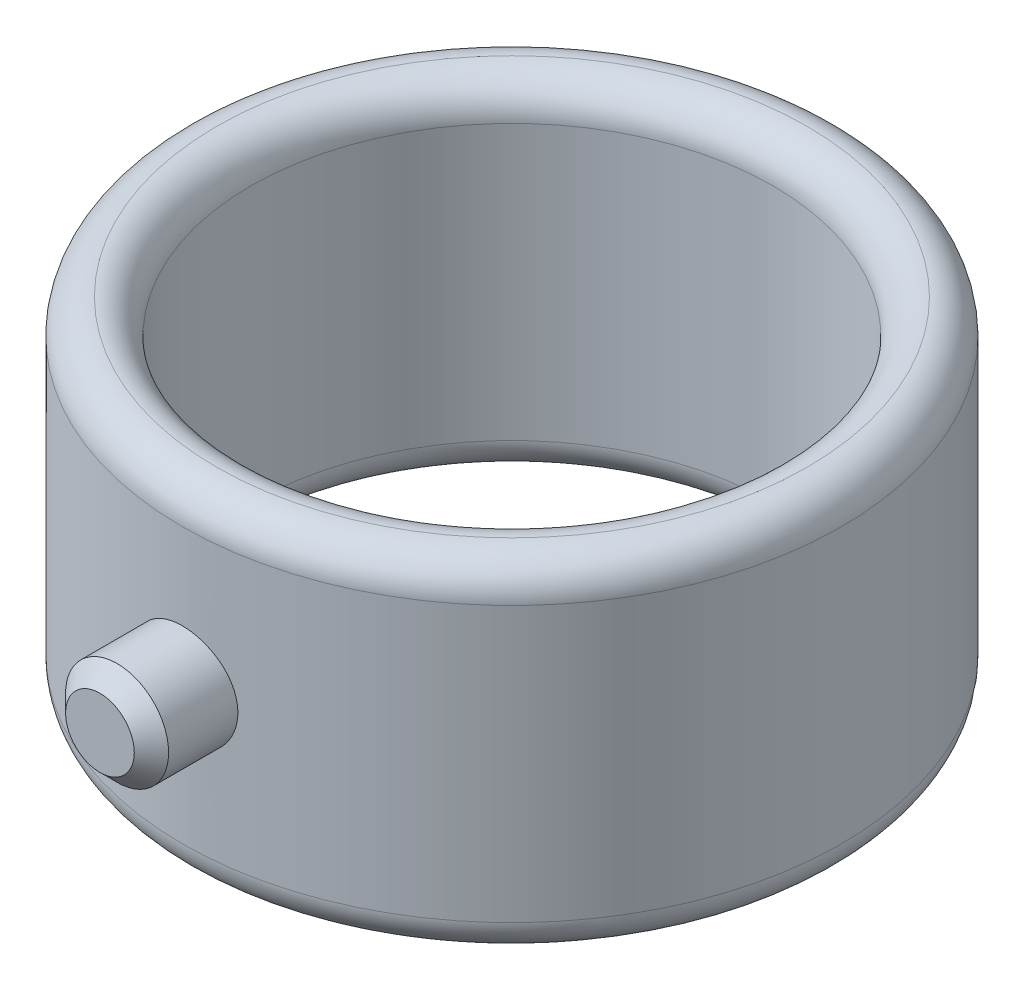
ISO-10303-21;
HEADER;
FILE_DESCRIPTION(('STEP AP214'),'2;1');
FILE_NAME('part.step','',(''),(''),'','','');
FILE_SCHEMA(('AUTOMOTIVE_DESIGN { 1 0 10303 214 1 1 1 1 }'));
ENDSEC;
DATA;
#1=APPLICATION_CONTEXT('core data for automotive mechanical design processes');
#2=APPLICATION_PROTOCOL_DEFINITION('international standard','automotive_design',2000,#1);
#3=PRODUCT_CONTEXT('',#1,'mechanical');
#4=PRODUCT('Part','Part','',(#3));
#5=PRODUCT_RELATED_PRODUCT_CATEGORY('part','',(#4));
#6=PRODUCT_DEFINITION_FORMATION('','',#4);
#7=PRODUCT_DEFINITION_CONTEXT('part definition',#1,'design');
#8=PRODUCT_DEFINITION('design','',#6,#7);
#9=PRODUCT_DEFINITION_SHAPE('','',#8);
#10=(LENGTH_UNIT() NAMED_UNIT(*) SI_UNIT(.MILLI.,.METRE.));
#11=(NAMED_UNIT(*) PLANE_ANGLE_UNIT() SI_UNIT($,.RADIAN.));
#12=(NAMED_UNIT(*) SI_UNIT($,.STERADIAN.) SOLID_ANGLE_UNIT());
#13=UNCERTAINTY_MEASURE_WITH_UNIT(LENGTH_MEASURE(1.E-05),#10,'distance_accuracy_value','');
#14=(GEOMETRIC_REPRESENTATION_CONTEXT(3) GLOBAL_UNCERTAINTY_ASSIGNED_CONTEXT((#13)) GLOBAL_UNIT_ASSIGNED_CONTEXT((#10,
#11,#12)) REPRESENTATION_CONTEXT('',''));
#15=CARTESIAN_POINT('',(0.,0.,0.));
#16=DIRECTION('',(0.,0.,1.));
#17=DIRECTION('',(1.,0.,0.));
#18=AXIS2_PLACEMENT_3D('',#15,#16,#17);
#19=CARTESIAN_POINT('',(0.,10.,0.));
#20=DIRECTION('',(0.,-1.,0.));
#21=DIRECTION('',(0.,0.,-1.));
#22=AXIS2_PLACEMENT_3D('',#19,#20,#21);
#23=CYLINDRICAL_SURFACE('',#22,9.6);
#24=CARTESIAN_POINT('',(0.,0.999999999999999,0.));
#25=DIRECTION('',(0.,1.,0.));
#26=DIRECTION('',(0.,0.,1.));
#27=AXIS2_PLACEMENT_3D('',#24,#25,#26);
#28=CIRCLE('',#27,9.6);
#29=CARTESIAN_POINT('',(0.,0.999999999999999,9.6));
#30=VERTEX_POINT('',#29);
#31=EDGE_CURVE('E61',#30,#30,#28,.T.);
#32=ORIENTED_EDGE('',*,*,#31,.T.);
#33=EDGE_LOOP('',(#32));
#34=FACE_BOUND('',#33,.T.);
#35=CARTESIAN_POINT('',(0.,9.,0.));
#36=DIRECTION('',(0.,1.,0.));
#37=DIRECTION('',(0.,0.,1.));
#38=AXIS2_PLACEMENT_3D('',#35,#36,#37);
#39=CIRCLE('',#38,9.6);
#40=CARTESIAN_POINT('',(0.,9.,9.6));
#41=VERTEX_POINT('',#40);
#42=EDGE_CURVE('E74',#41,#41,#39,.F.);
#43=ORIENTED_EDGE('',*,*,#42,.T.);
#44=EDGE_LOOP('',(#43));
#45=FACE_BOUND('',#44,.T.);
#46=CARTESIAN_POINT('',(0.,6.5,-9.6));
#47=CARTESIAN_POINT('',(-0.0837090583626197,6.49999658103709,-9.5999986211669));
#48=CARTESIAN_POINT('',(-0.167465642919422,6.49296913173587,-9.59889367491444));
#49=CARTESIAN_POINT('',(-0.332634788986861,6.46505378523395,-9.59459218858556));
#50=CARTESIAN_POINT('',(-0.41404503679399,6.44415266449789,-9.59139365306834));
#51=CARTESIAN_POINT('',(-0.572107522828442,6.38913220231603,-9.58326418299466));
#52=CARTESIAN_POINT('',(-0.648763411373941,6.35502315118304,-9.57833459737903));
#53=CARTESIAN_POINT('',(-0.795252750626759,6.27458087291503,-9.56728676422893));
#54=CARTESIAN_POINT('',(-0.865087086220985,6.22824923417843,-9.56116867117532));
#55=CARTESIAN_POINT('',(-0.996551946990971,6.12426017098763,-9.54836561048614));
#56=CARTESIAN_POINT('',(-1.05811648748559,6.06651980306585,-9.54167670835402));
#57=CARTESIAN_POINT('',(-1.17072461293694,5.94153083103867,-9.52851645678172));
#58=CARTESIAN_POINT('',(-1.22176757192515,5.87428166161988,-9.52204512030449));
#59=CARTESIAN_POINT('',(-1.3121432659733,5.73173703719377,-9.51001456876467));
#60=CARTESIAN_POINT('',(-1.35141164134795,5.65640031058292,-9.50446043871663));
#61=CARTESIAN_POINT('',(-1.41671208958239,5.50009915348532,-9.49494721045419));
#62=CARTESIAN_POINT('',(-1.44274494606038,5.41913505649366,-9.4909880178133));
#63=CARTESIAN_POINT('',(-1.480629355933,5.25457345931373,-9.48515180706622));
#64=CARTESIAN_POINT('',(-1.49259423292497,5.17100264850872,-9.48325815919418));
#65=CARTESIAN_POINT('',(-1.50235421854573,5.00301968666441,-9.48171702643064));
#66=CARTESIAN_POINT('',(-1.5001502091628,4.91860758832038,-9.48206940172813));
#67=CARTESIAN_POINT('',(-1.48172748485334,4.75214178088839,-9.48496530273124));
#68=CARTESIAN_POINT('',(-1.46563537775816,4.67007366598811,-9.48748903310967));
#69=CARTESIAN_POINT('',(-1.42009162700251,4.50981679618441,-9.49441233807284));
#70=CARTESIAN_POINT('',(-1.39063957610479,4.43162815961568,-9.49881196983847));
#71=CARTESIAN_POINT('',(-1.31908150169631,4.28096677239371,-9.50901304112773));
#72=CARTESIAN_POINT('',(-1.27692223389329,4.20851972493616,-9.51482035852347));
#73=CARTESIAN_POINT('',(-1.18118434887982,4.07168027858868,-9.52717827690059));
#74=CARTESIAN_POINT('',(-1.1276049195181,4.00728845306752,-9.53372893072927));
#75=CARTESIAN_POINT('',(-1.009854532934,3.88765385202001,-9.54692271749338));
#76=CARTESIAN_POINT('',(-0.945574803363235,3.83251810503833,-9.55356608181354));
#77=CARTESIAN_POINT('',(-0.808618168427616,3.73380011261606,-9.56613075208695));
#78=CARTESIAN_POINT('',(-0.735941220408792,3.6902179258659,-9.57205205437214));
#79=CARTESIAN_POINT('',(-0.584157556233895,3.61583715594656,-9.58251239416222));
#80=CARTESIAN_POINT('',(-0.505046511744277,3.5850472648802,-9.5870504912516));
#81=CARTESIAN_POINT('',(-0.342689720818056,3.53722041953166,-9.59422536000406));
#82=CARTESIAN_POINT('',(-0.25944427841232,3.52018245556011,-9.59686227125386));
#83=CARTESIAN_POINT('',(-0.0921050020582412,3.50048643412988,-9.59991907036366));
#84=CARTESIAN_POINT('',(-0.00802887690522108,3.49768131261429,-9.60036163075716));
#85=CARTESIAN_POINT('',(0.159392727846985,3.50613962320159,-9.59904171894761));
#86=CARTESIAN_POINT('',(0.242738231955093,3.51740258155346,-9.59727932099786));
#87=CARTESIAN_POINT('',(0.405884067759423,3.55355503260811,-9.59176154215933));
#88=CARTESIAN_POINT('',(0.485700757233625,3.57837245496064,-9.58801670529231));
#89=CARTESIAN_POINT('',(0.640040440713976,3.64085305663927,-9.57895245410135));
#90=CARTESIAN_POINT('',(0.714563167823644,3.6785168830656,-9.57363296046043));
#91=CARTESIAN_POINT('',(0.856843321350245,3.76596319467595,-9.56195383644566));
#92=CARTESIAN_POINT('',(0.924543074270235,3.81583845205429,-9.55558637198052));
#93=CARTESIAN_POINT('',(1.05066417904684,3.92616325154467,-9.54254328278661));
#94=CARTESIAN_POINT('',(1.10908494268211,3.98661346352291,-9.53586763855605));
#95=CARTESIAN_POINT('',(1.21552848466014,4.11702871833033,-9.5228881652199));
#96=CARTESIAN_POINT('',(1.26345239150476,4.1870749082734,-9.51658824714482));
#97=CARTESIAN_POINT('',(1.34685340635984,4.3343096441968,-9.50514415683496));
#98=CARTESIAN_POINT('',(1.38233087266863,4.41149798449368,-9.49999995133198));
#99=CARTESIAN_POINT('',(1.43968063166997,4.57053778442851,-9.49147842811414));
#100=CARTESIAN_POINT('',(1.46160392968747,4.65237048125937,-9.48809449409376));
#101=CARTESIAN_POINT('',(1.49138473224321,4.81861348619839,-9.48345942168477));
#102=CARTESIAN_POINT('',(1.49924329850998,4.9030235992514,-9.48220812230663));
#103=CARTESIAN_POINT('',(1.50064471614454,5.07103922954448,-9.48198634826931));
#104=CARTESIAN_POINT('',(1.49434308329055,5.1546434581601,-9.48299109625741));
#105=CARTESIAN_POINT('',(1.4679373395354,5.31958717828657,-9.48711419365098));
#106=CARTESIAN_POINT('',(1.44783325852177,5.40092667470103,-9.4902325384797));
#107=CARTESIAN_POINT('',(1.39444997935111,5.55898269598431,-9.49822253312943));
#108=CARTESIAN_POINT('',(1.36118257043148,5.63570328695505,-9.50309261372045));
#109=CARTESIAN_POINT('',(1.2824326112785,5.78249936820576,-9.51403910428437));
#110=CARTESIAN_POINT('',(1.23694957692531,5.85257459497306,-9.52011556206496));
#111=CARTESIAN_POINT('',(1.13449804883448,5.9848793264761,-9.53286940855356));
#112=CARTESIAN_POINT('',(1.07741464256861,6.0470193179683,-9.53955240696173));
#113=CARTESIAN_POINT('',(0.953625567829224,6.16089274183204,-9.55272026184439));
#114=CARTESIAN_POINT('',(0.886917672470594,6.21262375915513,-9.55920507204073));
#115=CARTESIAN_POINT('',(0.745300115306048,6.30449073381894,-9.5712906147402));
#116=CARTESIAN_POINT('',(0.670343623285429,6.34455522365577,-9.57688580658161));
#117=CARTESIAN_POINT('',(0.51471112941467,6.41146459771577,-9.58650755903329));
#118=CARTESIAN_POINT('',(0.434041065949057,6.43832298353504,-9.59053572085272));
#119=CARTESIAN_POINT('',(0.294188543946956,6.47205981265435,-9.59566467518928));
#120=CARTESIAN_POINT('',(0.235863345390975,6.4825210943774,-9.59728194975673));
#121=CARTESIAN_POINT('',(0.118366678710349,6.49649234802745,-9.59945009218573));
#122=CARTESIAN_POINT('',(0.059195222501471,6.5000024177344,-9.60000097504779));
#123=CARTESIAN_POINT('',(0.,6.5,-9.6));
#124=B_SPLINE_CURVE_WITH_KNOTS('',3,(#46,#47,#48,#49,#50,#51,#52,#53,#54,#55,#56,#57,#58,#59,
#60,#61,#62,#63,#64,#65,#66,#67,#68,#69,#70,#71,#72,#73,#74,#75,#76,#77,#78,#79,#80,#81,#82,#83,
#84,#85,#86,#87,#88,#89,#90,#91,#92,#93,#94,#95,#96,#97,#98,#99,#100,#101,#102,#103,#104,#105,
#106,#107,#108,#109,#110,#111,#112,#113,#114,#115,#116,#117,#118,#119,#120,#121,#122,#123),
.UNSPECIFIED.,.T.,.F.,(4,2,2,2,2,2,2,2,2,2,2,2,2,2,2,2,2,2,2,2,2,2,2,2,2,2,2,2,2,2,2,2,2,2,2,2,
2,2,4),(0.,0.250910844286494,0.502061185516808,0.753016247664616,1.00393871275218,
1.2567574089132,1.50959114187253,1.76378267163455,2.01795915005543,2.27007378680997,
2.52217273002327,2.77199745613548,3.0218297979063,3.27272386441408,3.52363577935241,
3.7772743940062,4.03091429708296,4.28472626252739,4.5385195909792,4.78968512403549,
5.04084219917014,5.2906766685394,5.54052372445218,5.79233124881803,6.04415472960849,
6.29825688149755,6.55235171789389,6.80548446237079,7.05859809737578,7.30894548959214,
7.55929233971338,7.80941548179971,8.05954853802809,8.31229207389325,8.5650941828538,
8.81941382519905,9.07347291393768,9.25090809810924,9.42834078635225),.UNSPECIFIED.);
#125=CARTESIAN_POINT('',(0.,6.5,-9.6));
#126=VERTEX_POINT('',#125);
#127=EDGE_CURVE('E86',#126,#126,#124,.T.);
#128=ORIENTED_EDGE('',*,*,#127,.T.);
#129=EDGE_LOOP('',(#128));
#130=FACE_BOUND('',#129,.T.);
#131=CARTESIAN_POINT('',(1.5,5.,9.48208837756746));
#132=CARTESIAN_POINT('',(1.49999657507522,4.91629797300369,9.48208982097234));
#133=CARTESIAN_POINT('',(1.49297026645718,4.83254840141331,9.48320868250783));
#134=CARTESIAN_POINT('',(1.46505986187492,4.66739382262091,9.48755982632199));
#135=CARTESIAN_POINT('',(1.44416251681094,4.58599113471688,9.49079412914852));
#136=CARTESIAN_POINT('',(1.38915309628105,4.42794464620539,9.49900109471842));
#137=CARTESIAN_POINT('',(1.35505148953106,4.35129713127541,9.5039723800284));
#138=CARTESIAN_POINT('',(1.2746267508988,4.20482186549687,9.5150915389636));
#139=CARTESIAN_POINT('',(1.22830518963086,4.13499323980485,9.52123926135509));
#140=CARTESIAN_POINT('',(1.12432638066534,4.00352210890866,9.53407823108587));
#141=CARTESIAN_POINT('',(1.06658393170496,3.94194735536006,9.54077332706277));
#142=CARTESIAN_POINT('',(0.941586485926062,3.8293194677422,9.55391838496484));
#143=CARTESIAN_POINT('',(0.874330951901098,3.77826692826547,9.56036833302033));
#144=CARTESIAN_POINT('',(0.731780575114557,3.68788107377527,9.57233680291763));
#145=CARTESIAN_POINT('',(0.65644555581437,3.64861039761531,9.57785028098027));
#146=CARTESIAN_POINT('',(0.500148103076855,3.58330522716496,9.58728188946334));
#147=CARTESIAN_POINT('',(0.419185992082085,3.5572699751704,9.59120011120677));
#148=CARTESIAN_POINT('',(0.254631195269284,3.5193807686263,9.5969725714783));
#149=CARTESIAN_POINT('',(0.171065256096448,3.50741321055899,9.59884333563027));
#150=CARTESIAN_POINT('',(0.00309188613040046,3.49764617401798,9.60036678588572));
#151=CARTESIAN_POINT('',(-0.0813154937935141,3.49984584418889,9.60001960527282));
#152=CARTESIAN_POINT('',(-0.247800053833293,3.51826155576672,9.5971594433921));
#153=CARTESIAN_POINT('',(-0.329891125545106,3.53435536330419,9.59466535017589));
#154=CARTESIAN_POINT('',(-0.490193025206096,3.57991041717358,9.5878126437317));
#155=CARTESIAN_POINT('',(-0.568403746411307,3.60937203101248,9.58345397924323));
#156=CARTESIAN_POINT('',(-0.719092456075484,3.68095019351603,9.57332951052169));
#157=CARTESIAN_POINT('',(-0.791545794431023,3.72311780325677,9.5675580466225));
#158=CARTESIAN_POINT('',(-0.92839431391928,3.81887364837755,9.55525048212277));
#159=CARTESIAN_POINT('',(-0.992788919755944,3.87246269837299,9.5487143269969));
#160=CARTESIAN_POINT('',(-1.11241319112014,3.99022009224396,9.53552326953337));
#161=CARTESIAN_POINT('',(-1.16753775367845,4.05449519983692,9.52886784426126));
#162=CARTESIAN_POINT('',(-1.26623535628491,4.19143853880928,9.51625616306847));
#163=CARTESIAN_POINT('',(-1.30980831323001,4.26410683056444,9.51029991217789));
#164=CARTESIAN_POINT('',(-1.38418236381411,4.41588777686348,9.4997609568968));
#165=CARTESIAN_POINT('',(-1.41497198330496,4.49500614504407,9.49517948750935));
#166=CARTESIAN_POINT('',(-1.46279605876601,4.65737890922329,9.48793013945687));
#167=CARTESIAN_POINT('',(-1.47983157117155,4.74063298704183,9.48526211382445));
#168=CARTESIAN_POINT('',(-1.49951831542713,4.90797686196513,9.48216982181315));
#169=CARTESIAN_POINT('',(-1.50231884046763,4.99204868011685,9.48172226883598));
#170=CARTESIAN_POINT('',(-1.4938528741991,5.15946058117874,9.48305969863092));
#171=CARTESIAN_POINT('',(-1.48258685792597,5.24280068870352,9.48484460601146));
#172=CARTESIAN_POINT('',(-1.44643447533537,5.40591668447989,9.49042440631113));
#173=CARTESIAN_POINT('',(-1.42162307269187,5.48570959918376,9.49420823300011));
#174=CARTESIAN_POINT('',(-1.35916243345159,5.64000438266233,9.50335034638108));
#175=CARTESIAN_POINT('',(-1.32151251361769,5.71450596958941,9.50870871686466));
#176=CARTESIAN_POINT('',(-1.23408719502176,5.85677076898929,9.52045075324266));
#177=CARTESIAN_POINT('',(-1.18421550656083,5.92447413733998,9.52684241675857));
#178=CARTESIAN_POINT('',(-1.0738955639717,6.05060418850893,9.53990702817724));
#179=CARTESIAN_POINT('',(-1.01344665912852,6.10903030016422,9.54657999336663));
#180=CARTESIAN_POINT('',(-0.883029280594847,6.21548676238128,9.55952843324731));
#181=CARTESIAN_POINT('',(-0.8129793849539,6.26341794585804,9.56579975052986));
#182=CARTESIAN_POINT('',(-0.665735166176022,6.34683171199414,9.57717293604501));
#183=CARTESIAN_POINT('',(-0.588541051897493,6.38231465842757,9.58227483844984));
#184=CARTESIAN_POINT('',(-0.429503798266993,6.43966776517049,9.59071618606101));
#185=CARTESIAN_POINT('',(-0.34768028857025,6.46159129846364,9.59406253353432));
#186=CARTESIAN_POINT('',(-0.181456769862445,6.49137567960369,9.59864477873672));
#187=CARTESIAN_POINT('',(-0.0970569465926576,6.49923753881358,9.59988082824525));
#188=CARTESIAN_POINT('',(0.070963299112967,6.50064911159313,9.60010146076783));
#189=CARTESIAN_POINT('',(0.154582457315882,6.49435024678564,9.59910986423992));
#190=CARTESIAN_POINT('',(0.319556757278924,6.4679448102918,9.59503486808557));
#191=CARTESIAN_POINT('',(0.400911908148958,6.447838294173,9.59195147687734));
#192=CARTESIAN_POINT('',(0.559001310257671,6.39444364417253,9.58403784852891));
#193=CARTESIAN_POINT('',(0.635739477909858,6.36116686905123,9.57920911697729));
#194=CARTESIAN_POINT('',(0.782566843519209,6.282392696887,9.56833399386873));
#195=CARTESIAN_POINT('',(0.852655788872354,6.23689483581627,9.56228755607834));
#196=CARTESIAN_POINT('',(0.984961315115224,6.13442633407417,9.54957169334352));
#197=CARTESIAN_POINT('',(1.0470910168959,6.07734421141458,9.54289658125157));
#198=CARTESIAN_POINT('',(1.16094427642019,5.95356202560177,9.52971677266365));
#199=CARTESIAN_POINT('',(1.21266539137249,5.8868597109764,9.5232121164828));
#200=CARTESIAN_POINT('',(1.30452090925426,5.74524733742517,9.51106678478421));
#201=CARTESIAN_POINT('',(1.34458226488972,5.67028942479549,9.5054316558568));
#202=CARTESIAN_POINT('',(1.41148539364492,5.51465406938293,9.495728600755));
#203=CARTESIAN_POINT('',(1.43834070035522,5.43398257931969,9.49165907108587));
#204=CARTESIAN_POINT('',(1.4720694417436,5.29413815618773,9.48647458010032));
#205=CARTESIAN_POINT('',(1.48252709565224,5.23582304001123,9.48483862788874));
#206=CARTESIAN_POINT('',(1.49649353447294,5.11834653137002,9.48264502425295));
#207=CARTESIAN_POINT('',(1.50000242174173,5.05918515138388,9.4820873569454));
#208=CARTESIAN_POINT('',(1.5,5.,9.48208837756746));
#209=B_SPLINE_CURVE_WITH_KNOTS('',3,(#131,#132,#133,#134,#135,#136,#137,#138,#139,#140,#141,
#142,#143,#144,#145,#146,#147,#148,#149,#150,#151,#152,#153,#154,#155,#156,#157,#158,#159,#160,
#161,#162,#163,#164,#165,#166,#167,#168,#169,#170,#171,#172,#173,#174,#175,#176,#177,#178,#179,
#180,#181,#182,#183,#184,#185,#186,#187,#188,#189,#190,#191,#192,#193,#194,#195,#196,#197,#198,
#199,#200,#201,#202,#203,#204,#205,#206,#207,#208),.UNSPECIFIED.,.T.,.F.,(4,2,2,2,2,2,2,2,2,2,2,
2,2,2,2,2,2,2,2,2,2,2,2,2,2,2,2,2,2,2,2,2,2,2,2,2,2,2,4),(0.,0.250889716729551,
0.502019419521554,0.752950425847427,1.00384919604845,1.25669554828362,1.509556184524,
1.76373826811088,2.01790579859255,2.27000638508221,2.52209182215906,2.77198187488182,
3.02187879798456,3.27279367756211,3.52372645922249,3.77733626034883,4.03094788591224,
4.28478666020901,4.53860593561942,4.78975764018386,5.04090086342789,5.29066808068935,
5.54044859207726,5.79226411699899,6.04409513917218,6.29821183197281,6.55232109811785,
6.80542365737055,7.05850801190181,7.30889900441512,7.55928898926006,7.80946349286817,
8.05964749680529,8.31236424238798,8.56514022907548,8.81946732995135,9.07353324980331,
9.25093832744559,9.42834079185605),.UNSPECIFIED.);
#210=CARTESIAN_POINT('',(1.5,5.,9.48208837756746));
#211=VERTEX_POINT('',#210);
#212=EDGE_CURVE('E70',#211,#211,#209,.T.);
#213=ORIENTED_EDGE('',*,*,#212,.T.);
#214=EDGE_LOOP('',(#213));
#215=FACE_BOUND('',#214,.T.);
#216=ADVANCED_FACE('F37',(#34,#45,#130,#215),#23,.T.);
#217=CARTESIAN_POINT('',(0.,5.,12.));
#218=DIRECTION('',(0.,0.,1.));
#219=DIRECTION('',(1.,0.,0.));
#220=AXIS2_PLACEMENT_3D('',#217,#218,#219);
#221=PLANE('',#220);
#222=CARTESIAN_POINT('',(0.,5.,12.));
#223=DIRECTION('',(0.,0.,1.));
#224=DIRECTION('',(1.,0.,0.));
#225=AXIS2_PLACEMENT_3D('',#222,#223,#224);
#226=CIRCLE('',#225,1.);
#227=CARTESIAN_POINT('',(1.,5.,12.));
#228=VERTEX_POINT('',#227);
#229=EDGE_CURVE('E45',#228,#228,#226,.T.);
#230=ORIENTED_EDGE('',*,*,#229,.T.);
#231=EDGE_LOOP('',(#230));
#232=FACE_BOUND('',#231,.T.);
#233=ADVANCED_FACE('F112',(#232),#221,.T.);
#234=CARTESIAN_POINT('',(0.,5.,-12.));
#235=DIRECTION('',(0.,0.,1.));
#236=DIRECTION('',(1.,0.,0.));
#237=AXIS2_PLACEMENT_3D('',#234,#235,#236);
#238=CYLINDRICAL_SURFACE('',#237,1.5);
#239=CARTESIAN_POINT('',(0.,5.,11.5));
#240=DIRECTION('',(0.,0.,1.));
#241=DIRECTION('',(1.,0.,0.));
#242=AXIS2_PLACEMENT_3D('',#239,#240,#241);
#243=CIRCLE('',#242,1.5);
#244=CARTESIAN_POINT('',(1.5,5.,11.5));
#245=VERTEX_POINT('',#244);
#246=EDGE_CURVE('E10',#245,#245,#243,.F.);
#247=ORIENTED_EDGE('',*,*,#246,.T.);
#248=EDGE_LOOP('',(#247));
#249=FACE_BOUND('',#248,.T.);
#250=ORIENTED_EDGE('',*,*,#212,.F.);
#251=EDGE_LOOP('',(#250));
#252=FACE_BOUND('',#251,.T.);
#253=ADVANCED_FACE('F105',(#249,#252),#238,.T.);
#254=CARTESIAN_POINT('',(0.,5.,-11.5));
#255=DIRECTION('',(0.,0.,1.));
#256=DIRECTION('',(1.,0.,0.));
#257=AXIS2_PLACEMENT_3D('',#254,#255,#256);
#258=CIRCLE('',#257,1.5);
#259=CARTESIAN_POINT('',(1.5,5.,-11.5));
#260=VERTEX_POINT('',#259);
#261=EDGE_CURVE('E55',#260,#260,#258,.T.);
#262=ORIENTED_EDGE('',*,*,#261,.T.);
#263=EDGE_LOOP('',(#262));
#264=FACE_BOUND('',#263,.T.);
#265=ORIENTED_EDGE('',*,*,#127,.F.);
#266=EDGE_LOOP('',(#265));
#267=FACE_BOUND('',#266,.T.);
#268=ADVANCED_FACE('F100',(#264,#267),#238,.T.);
#269=CARTESIAN_POINT('',(0.,5.,-12.));
#270=DIRECTION('',(0.,0.,1.));
#271=DIRECTION('',(1.,0.,0.));
#272=AXIS2_PLACEMENT_3D('',#269,#270,#271);
#273=PLANE('',#272);
#274=CARTESIAN_POINT('',(0.,5.,-12.));
#275=DIRECTION('',(0.,0.,1.));
#276=DIRECTION('',(1.,0.,0.));
#277=AXIS2_PLACEMENT_3D('',#274,#275,#276);
#278=CIRCLE('',#277,1.);
#279=CARTESIAN_POINT('',(1.,5.,-12.));
#280=VERTEX_POINT('',#279);
#281=EDGE_CURVE('E50',#280,#280,#278,.F.);
#282=ORIENTED_EDGE('',*,*,#281,.T.);
#283=EDGE_LOOP('',(#282));
#284=FACE_BOUND('',#283,.T.);
#285=ADVANCED_FACE('F104',(#284),#273,.F.);
#286=CARTESIAN_POINT('',(0.,-2.,0.));
#287=DIRECTION('',(0.,1.,0.));
#288=DIRECTION('',(0.,0.,1.));
#289=AXIS2_PLACEMENT_3D('',#286,#287,#288);
#290=CYLINDRICAL_SURFACE('',#289,7.6);
#291=CARTESIAN_POINT('',(0.,1.,0.));
#292=DIRECTION('',(0.,1.,0.));
#293=DIRECTION('',(0.,0.,1.));
#294=AXIS2_PLACEMENT_3D('',#291,#292,#293);
#295=CIRCLE('',#294,7.6);
#296=CARTESIAN_POINT('',(0.,1.,7.6));
#297=VERTEX_POINT('',#296);
#298=EDGE_CURVE('E78',#297,#297,#295,.F.);
#299=ORIENTED_EDGE('',*,*,#298,.T.);
#300=EDGE_LOOP('',(#299));
#301=FACE_BOUND('',#300,.T.);
#302=CARTESIAN_POINT('',(0.,9.,0.));
#303=DIRECTION('',(0.,1.,0.));
#304=DIRECTION('',(0.,0.,1.));
#305=AXIS2_PLACEMENT_3D('',#302,#303,#304);
#306=CIRCLE('',#305,7.6);
#307=CARTESIAN_POINT('',(0.,9.,7.6));
#308=VERTEX_POINT('',#307);
#309=EDGE_CURVE('E82',#308,#308,#306,.T.);
#310=ORIENTED_EDGE('',*,*,#309,.T.);
#311=EDGE_LOOP('',(#310));
#312=FACE_BOUND('',#311,.T.);
#313=ADVANCED_FACE('F110',(#301,#312),#290,.F.);
#314=CARTESIAN_POINT('',(0.,0.999999999999999,0.));
#315=DIRECTION('',(0.,1.,0.));
#316=DIRECTION('',(0.,0.,1.));
#317=AXIS2_PLACEMENT_3D('',#314,#315,#316);
#318=TOROIDAL_SURFACE('',#317,8.6,1.);
#319=ORIENTED_EDGE('',*,*,#31,.F.);
#320=EDGE_LOOP('',(#319));
#321=FACE_BOUND('',#320,.T.);
#322=CARTESIAN_POINT('',(0.,0.,0.));
#323=DIRECTION('',(0.,1.,0.));
#324=DIRECTION('',(0.,0.,1.));
#325=AXIS2_PLACEMENT_3D('',#322,#323,#324);
#326=CIRCLE('',#325,8.6);
#327=CARTESIAN_POINT('',(0.,0.,8.6));
#328=VERTEX_POINT('',#327);
#329=EDGE_CURVE('E66',#328,#328,#326,.F.);
#330=ORIENTED_EDGE('',*,*,#329,.F.);
#331=EDGE_LOOP('',(#330));
#332=FACE_BOUND('',#331,.T.);
#333=ADVANCED_FACE('F116',(#321,#332),#318,.T.);
#334=CARTESIAN_POINT('',(0.,1.,0.));
#335=DIRECTION('',(0.,1.,0.));
#336=DIRECTION('',(0.,0.,1.));
#337=AXIS2_PLACEMENT_3D('',#334,#335,#336);
#338=TOROIDAL_SURFACE('',#337,8.6,1.);
#339=ORIENTED_EDGE('',*,*,#298,.F.);
#340=EDGE_LOOP('',(#339));
#341=FACE_BOUND('',#340,.T.);
#342=ORIENTED_EDGE('',*,*,#329,.T.);
#343=EDGE_LOOP('',(#342));
#344=FACE_BOUND('',#343,.T.);
#345=ADVANCED_FACE('F121',(#341,#344),#338,.T.);
#346=CARTESIAN_POINT('',(0.,9.,0.));
#347=DIRECTION('',(0.,1.,0.));
#348=DIRECTION('',(0.,0.,1.));
#349=AXIS2_PLACEMENT_3D('',#346,#347,#348);
#350=TOROIDAL_SURFACE('',#349,8.6,1.);
#351=ORIENTED_EDGE('',*,*,#42,.F.);
#352=EDGE_LOOP('',(#351));
#353=FACE_BOUND('',#352,.T.);
#354=CARTESIAN_POINT('',(0.,10.,0.));
#355=DIRECTION('',(0.,1.,0.));
#356=DIRECTION('',(0.,0.,1.));
#357=AXIS2_PLACEMENT_3D('',#354,#355,#356);
#358=CIRCLE('',#357,8.6);
#359=CARTESIAN_POINT('',(0.,10.,8.6));
#360=VERTEX_POINT('',#359);
#361=EDGE_CURVE('E62',#360,#360,#358,.T.);
#362=ORIENTED_EDGE('',*,*,#361,.F.);
#363=EDGE_LOOP('',(#362));
#364=FACE_BOUND('',#363,.T.);
#365=ADVANCED_FACE('F181',(#353,#364),#350,.T.);
#366=CARTESIAN_POINT('',(0.,9.,0.));
#367=DIRECTION('',(0.,1.,0.));
#368=DIRECTION('',(0.,0.,1.));
#369=AXIS2_PLACEMENT_3D('',#366,#367,#368);
#370=TOROIDAL_SURFACE('',#369,8.6,1.);
#371=ORIENTED_EDGE('',*,*,#361,.T.);
#372=EDGE_LOOP('',(#371));
#373=FACE_BOUND('',#372,.T.);
#374=ORIENTED_EDGE('',*,*,#309,.F.);
#375=EDGE_LOOP('',(#374));
#376=FACE_BOUND('',#375,.T.);
#377=ADVANCED_FACE('F163',(#373,#376),#370,.T.);
#378=CARTESIAN_POINT('',(0.,5.,-11.5));
#379=DIRECTION('',(0.,0.,1.));
#380=DIRECTION('',(1.,0.,0.));
#381=AXIS2_PLACEMENT_3D('',#378,#379,#380);
#382=CONICAL_SURFACE('',#381,1.5,0.78539816339745);
#383=ORIENTED_EDGE('',*,*,#281,.F.);
#384=EDGE_LOOP('',(#383));
#385=FACE_BOUND('',#384,.T.);
#386=ORIENTED_EDGE('',*,*,#261,.F.);
#387=EDGE_LOOP('',(#386));
#388=FACE_BOUND('',#387,.T.);
#389=ADVANCED_FACE('F158',(#385,#388),#382,.T.);
#390=CARTESIAN_POINT('',(0.,5.,12.));
#391=DIRECTION('',(0.,0.,-1.));
#392=DIRECTION('',(-1.,0.,0.));
#393=AXIS2_PLACEMENT_3D('',#390,#391,#392);
#394=CONICAL_SURFACE('',#393,1.,0.785398163397447);
#395=ORIENTED_EDGE('',*,*,#246,.F.);
#396=EDGE_LOOP('',(#395));
#397=FACE_BOUND('',#396,.T.);
#398=ORIENTED_EDGE('',*,*,#229,.F.);
#399=EDGE_LOOP('',(#398));
#400=FACE_BOUND('',#399,.T.);
#401=ADVANCED_FACE('F39',(#397,#400),#394,.T.);
#402=CLOSED_SHELL('',(#216,#233,#253,#268,#285,#313,#333,#345,#365,#377,#389,#401));
#403=MANIFOLD_SOLID_BREP('B2',#402);
#404=ADVANCED_BREP_SHAPE_REPRESENTATION('',(#18,#403),#14);
#405=SHAPE_DEFINITION_REPRESENTATION(#9,#404);
ENDSEC;
END-ISO-10303-21;
